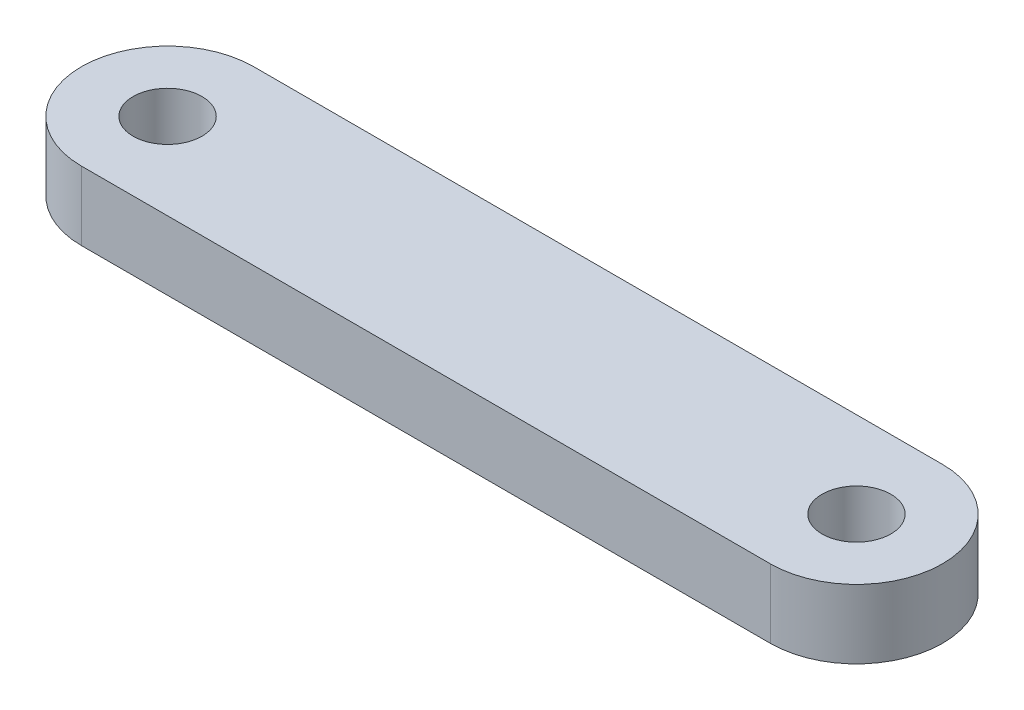
ISO-10303-21;
HEADER;
FILE_DESCRIPTION(('STEP AP214'),'2;1');
FILE_NAME('part.step','',(''),(''),'','','');
FILE_SCHEMA(('AUTOMOTIVE_DESIGN { 1 0 10303 214 1 1 1 1 }'));
ENDSEC;
DATA;
#1=APPLICATION_CONTEXT('core data for automotive mechanical design processes');
#2=APPLICATION_PROTOCOL_DEFINITION('international standard','automotive_design',2000,#1);
#3=PRODUCT_CONTEXT('',#1,'mechanical');
#4=PRODUCT('Part','Part','',(#3));
#5=PRODUCT_RELATED_PRODUCT_CATEGORY('part','',(#4));
#6=PRODUCT_DEFINITION_FORMATION('','',#4);
#7=PRODUCT_DEFINITION_CONTEXT('part definition',#1,'design');
#8=PRODUCT_DEFINITION('design','',#6,#7);
#9=PRODUCT_DEFINITION_SHAPE('','',#8);
#10=(LENGTH_UNIT() NAMED_UNIT(*) SI_UNIT(.MILLI.,.METRE.));
#11=(NAMED_UNIT(*) PLANE_ANGLE_UNIT() SI_UNIT($,.RADIAN.));
#12=(NAMED_UNIT(*) SI_UNIT($,.STERADIAN.) SOLID_ANGLE_UNIT());
#13=UNCERTAINTY_MEASURE_WITH_UNIT(LENGTH_MEASURE(1.E-05),#10,'distance_accuracy_value','');
#14=(GEOMETRIC_REPRESENTATION_CONTEXT(3) GLOBAL_UNCERTAINTY_ASSIGNED_CONTEXT((#13)) GLOBAL_UNIT_ASSIGNED_CONTEXT((#10,
#11,#12)) REPRESENTATION_CONTEXT('',''));
#15=CARTESIAN_POINT('',(0.,0.,0.));
#16=DIRECTION('',(0.,0.,1.));
#17=DIRECTION('',(1.,0.,0.));
#18=AXIS2_PLACEMENT_3D('',#15,#16,#17);
#19=CARTESIAN_POINT('',(-10.,2.,0.));
#20=DIRECTION('',(0.,1.,0.));
#21=DIRECTION('',(0.,0.,1.));
#22=AXIS2_PLACEMENT_3D('',#19,#20,#21);
#23=PLANE('',#22);
#24=CARTESIAN_POINT('',(10.,2.,0.));
#25=DIRECTION('',(0.,1.,0.));
#26=DIRECTION('',(0.,0.,1.));
#27=AXIS2_PLACEMENT_3D('',#24,#25,#26);
#28=CIRCLE('',#27,1.);
#29=CARTESIAN_POINT('',(10.,2.,1.));
#30=VERTEX_POINT('',#29);
#31=EDGE_CURVE('E104',#30,#30,#28,.T.);
#32=ORIENTED_EDGE('',*,*,#31,.F.);
#33=EDGE_LOOP('',(#32));
#34=FACE_BOUND('',#33,.T.);
#35=CARTESIAN_POINT('',(-10.,2.,0.));
#36=DIRECTION('',(0.,1.,0.));
#37=DIRECTION('',(0.,0.,1.));
#38=AXIS2_PLACEMENT_3D('',#35,#36,#37);
#39=CIRCLE('',#38,2.5);
#40=CARTESIAN_POINT('',(-10.,2.,-2.5));
#41=VERTEX_POINT('',#40);
#42=CARTESIAN_POINT('',(-10.,2.,2.5));
#43=VERTEX_POINT('',#42);
#44=EDGE_CURVE('E89',#41,#43,#39,.T.);
#45=ORIENTED_EDGE('',*,*,#44,.T.);
#46=DIRECTION('',(1.,0.,0.));
#47=VECTOR('',#46,1.);
#48=CARTESIAN_POINT('',(-10.,2.,2.5));
#49=LINE('',#48,#47);
#50=CARTESIAN_POINT('',(10.,2.,2.5));
#51=VERTEX_POINT('',#50);
#52=EDGE_CURVE('E84',#43,#51,#49,.T.);
#53=ORIENTED_EDGE('',*,*,#52,.T.);
#54=CARTESIAN_POINT('',(10.,2.,0.));
#55=DIRECTION('',(0.,1.,0.));
#56=DIRECTION('',(0.,0.,1.));
#57=AXIS2_PLACEMENT_3D('',#54,#55,#56);
#58=CIRCLE('',#57,2.5);
#59=CARTESIAN_POINT('',(10.,2.,-2.5));
#60=VERTEX_POINT('',#59);
#61=EDGE_CURVE('E87',#51,#60,#58,.T.);
#62=ORIENTED_EDGE('',*,*,#61,.T.);
#63=DIRECTION('',(-1.,0.,0.));
#64=VECTOR('',#63,1.);
#65=CARTESIAN_POINT('',(-10.,2.,-2.5));
#66=LINE('',#65,#64);
#67=EDGE_CURVE('E54',#60,#41,#66,.T.);
#68=ORIENTED_EDGE('',*,*,#67,.T.);
#69=EDGE_LOOP('',(#45,#53,#62,#68));
#70=FACE_BOUND('',#69,.T.);
#71=CARTESIAN_POINT('',(-10.,2.,0.));
#72=DIRECTION('',(0.,1.,0.));
#73=DIRECTION('',(0.,0.,1.));
#74=AXIS2_PLACEMENT_3D('',#71,#72,#73);
#75=CIRCLE('',#74,1.);
#76=CARTESIAN_POINT('',(-10.,2.,1.));
#77=VERTEX_POINT('',#76);
#78=EDGE_CURVE('E119',#77,#77,#75,.T.);
#79=ORIENTED_EDGE('',*,*,#78,.F.);
#80=EDGE_LOOP('',(#79));
#81=FACE_BOUND('',#80,.T.);
#82=ADVANCED_FACE('F37',(#34,#70,#81),#23,.T.);
#83=CARTESIAN_POINT('',(-10.,0.,0.));
#84=DIRECTION('',(0.,1.,0.));
#85=DIRECTION('',(0.,0.,1.));
#86=AXIS2_PLACEMENT_3D('',#83,#84,#85);
#87=PLANE('',#86);
#88=CARTESIAN_POINT('',(-10.,0.,0.));
#89=DIRECTION('',(0.,1.,0.));
#90=DIRECTION('',(0.,0.,1.));
#91=AXIS2_PLACEMENT_3D('',#88,#89,#90);
#92=CIRCLE('',#91,2.5);
#93=CARTESIAN_POINT('',(-10.,0.,-2.5));
#94=VERTEX_POINT('',#93);
#95=CARTESIAN_POINT('',(-10.,0.,2.5));
#96=VERTEX_POINT('',#95);
#97=EDGE_CURVE('E101',#94,#96,#92,.T.);
#98=ORIENTED_EDGE('',*,*,#97,.F.);
#99=DIRECTION('',(-1.,0.,0.));
#100=VECTOR('',#99,1.);
#101=CARTESIAN_POINT('',(-10.,0.,-2.5));
#102=LINE('',#101,#100);
#103=CARTESIAN_POINT('',(10.,0.,-2.5));
#104=VERTEX_POINT('',#103);
#105=EDGE_CURVE('E77',#104,#94,#102,.T.);
#106=ORIENTED_EDGE('',*,*,#105,.F.);
#107=CARTESIAN_POINT('',(10.,0.,0.));
#108=DIRECTION('',(0.,1.,0.));
#109=DIRECTION('',(0.,0.,1.));
#110=AXIS2_PLACEMENT_3D('',#107,#108,#109);
#111=CIRCLE('',#110,2.5);
#112=CARTESIAN_POINT('',(10.,0.,2.5));
#113=VERTEX_POINT('',#112);
#114=EDGE_CURVE('E71',#113,#104,#111,.T.);
#115=ORIENTED_EDGE('',*,*,#114,.F.);
#116=DIRECTION('',(1.,0.,0.));
#117=VECTOR('',#116,1.);
#118=CARTESIAN_POINT('',(-10.,0.,2.5));
#119=LINE('',#118,#117);
#120=EDGE_CURVE('E93',#96,#113,#119,.T.);
#121=ORIENTED_EDGE('',*,*,#120,.F.);
#122=EDGE_LOOP('',(#98,#106,#115,#121));
#123=FACE_BOUND('',#122,.T.);
#124=CARTESIAN_POINT('',(10.,0.,0.));
#125=DIRECTION('',(0.,1.,0.));
#126=DIRECTION('',(0.,0.,1.));
#127=AXIS2_PLACEMENT_3D('',#124,#125,#126);
#128=CIRCLE('',#127,1.);
#129=CARTESIAN_POINT('',(10.,0.,1.));
#130=VERTEX_POINT('',#129);
#131=EDGE_CURVE('E116',#130,#130,#128,.T.);
#132=ORIENTED_EDGE('',*,*,#131,.T.);
#133=EDGE_LOOP('',(#132));
#134=FACE_BOUND('',#133,.T.);
#135=CARTESIAN_POINT('',(-10.,0.,0.));
#136=DIRECTION('',(0.,1.,0.));
#137=DIRECTION('',(0.,0.,1.));
#138=AXIS2_PLACEMENT_3D('',#135,#136,#137);
#139=CIRCLE('',#138,1.);
#140=CARTESIAN_POINT('',(-10.,0.,1.));
#141=VERTEX_POINT('',#140);
#142=EDGE_CURVE('E122',#141,#141,#139,.T.);
#143=ORIENTED_EDGE('',*,*,#142,.T.);
#144=EDGE_LOOP('',(#143));
#145=FACE_BOUND('',#144,.T.);
#146=ADVANCED_FACE('F112',(#123,#134,#145),#87,.F.);
#147=CARTESIAN_POINT('',(-10.,2.,0.));
#148=DIRECTION('',(0.,-1.,0.));
#149=DIRECTION('',(0.,0.,-1.));
#150=AXIS2_PLACEMENT_3D('',#147,#148,#149);
#151=CYLINDRICAL_SURFACE('',#150,2.5);
#152=ORIENTED_EDGE('',*,*,#97,.T.);
#153=DIRECTION('',(0.,-1.,0.));
#154=VECTOR('',#153,1.);
#155=CARTESIAN_POINT('',(-10.,2.,2.5));
#156=LINE('',#155,#154);
#157=EDGE_CURVE('E11',#43,#96,#156,.T.);
#158=ORIENTED_EDGE('',*,*,#157,.F.);
#159=ORIENTED_EDGE('',*,*,#44,.F.);
#160=DIRECTION('',(0.,-1.,0.));
#161=VECTOR('',#160,1.);
#162=CARTESIAN_POINT('',(-10.,2.,-2.5));
#163=LINE('',#162,#161);
#164=EDGE_CURVE('E97',#41,#94,#163,.T.);
#165=ORIENTED_EDGE('',*,*,#164,.T.);
#166=EDGE_LOOP('',(#152,#158,#159,#165));
#167=FACE_BOUND('',#166,.T.);
#168=ADVANCED_FACE('F39',(#167),#151,.T.);
#169=CARTESIAN_POINT('',(-10.,2.,2.5));
#170=DIRECTION('',(0.,0.,-1.));
#171=DIRECTION('',(-1.,0.,0.));
#172=AXIS2_PLACEMENT_3D('',#169,#170,#171);
#173=PLANE('',#172);
#174=ORIENTED_EDGE('',*,*,#120,.T.);
#175=DIRECTION('',(0.,-1.,0.));
#176=VECTOR('',#175,1.);
#177=CARTESIAN_POINT('',(10.,2.,2.5));
#178=LINE('',#177,#176);
#179=EDGE_CURVE('E46',#51,#113,#178,.T.);
#180=ORIENTED_EDGE('',*,*,#179,.F.);
#181=ORIENTED_EDGE('',*,*,#52,.F.);
#182=ORIENTED_EDGE('',*,*,#157,.T.);
#183=EDGE_LOOP('',(#174,#180,#181,#182));
#184=FACE_BOUND('',#183,.T.);
#185=ADVANCED_FACE('F92',(#184),#173,.F.);
#186=CARTESIAN_POINT('',(10.,2.,0.));
#187=DIRECTION('',(0.,-1.,0.));
#188=DIRECTION('',(0.,0.,-1.));
#189=AXIS2_PLACEMENT_3D('',#186,#187,#188);
#190=CYLINDRICAL_SURFACE('',#189,2.5);
#191=ORIENTED_EDGE('',*,*,#114,.T.);
#192=DIRECTION('',(0.,-1.,0.));
#193=VECTOR('',#192,1.);
#194=CARTESIAN_POINT('',(10.,2.,-2.5));
#195=LINE('',#194,#193);
#196=EDGE_CURVE('E94',#60,#104,#195,.T.);
#197=ORIENTED_EDGE('',*,*,#196,.F.);
#198=ORIENTED_EDGE('',*,*,#61,.F.);
#199=ORIENTED_EDGE('',*,*,#179,.T.);
#200=EDGE_LOOP('',(#191,#197,#198,#199));
#201=FACE_BOUND('',#200,.T.);
#202=ADVANCED_FACE('F95',(#201),#190,.T.);
#203=CARTESIAN_POINT('',(-10.,2.,-2.5));
#204=DIRECTION('',(0.,0.,1.));
#205=DIRECTION('',(1.,0.,0.));
#206=AXIS2_PLACEMENT_3D('',#203,#204,#205);
#207=PLANE('',#206);
#208=ORIENTED_EDGE('',*,*,#105,.T.);
#209=ORIENTED_EDGE('',*,*,#164,.F.);
#210=ORIENTED_EDGE('',*,*,#67,.F.);
#211=ORIENTED_EDGE('',*,*,#196,.T.);
#212=EDGE_LOOP('',(#208,#209,#210,#211));
#213=FACE_BOUND('',#212,.T.);
#214=ADVANCED_FACE('F109',(#213),#207,.F.);
#215=CARTESIAN_POINT('',(10.,2.,0.));
#216=DIRECTION('',(0.,-1.,0.));
#217=DIRECTION('',(0.,0.,-1.));
#218=AXIS2_PLACEMENT_3D('',#215,#216,#217);
#219=CYLINDRICAL_SURFACE('',#218,1.);
#220=ORIENTED_EDGE('',*,*,#31,.T.);
#221=EDGE_LOOP('',(#220));
#222=FACE_BOUND('',#221,.T.);
#223=ORIENTED_EDGE('',*,*,#131,.F.);
#224=EDGE_LOOP('',(#223));
#225=FACE_BOUND('',#224,.T.);
#226=ADVANCED_FACE('F139',(#222,#225),#219,.F.);
#227=CARTESIAN_POINT('',(-10.,2.,0.));
#228=DIRECTION('',(0.,-1.,0.));
#229=DIRECTION('',(0.,0.,-1.));
#230=AXIS2_PLACEMENT_3D('',#227,#228,#229);
#231=CYLINDRICAL_SURFACE('',#230,1.);
#232=ORIENTED_EDGE('',*,*,#78,.T.);
#233=EDGE_LOOP('',(#232));
#234=FACE_BOUND('',#233,.T.);
#235=ORIENTED_EDGE('',*,*,#142,.F.);
#236=EDGE_LOOP('',(#235));
#237=FACE_BOUND('',#236,.T.);
#238=ADVANCED_FACE('F128',(#234,#237),#231,.F.);
#239=CLOSED_SHELL('',(#82,#146,#168,#185,#202,#214,#226,#238));
#240=MANIFOLD_SOLID_BREP('B2',#239);
#241=ADVANCED_BREP_SHAPE_REPRESENTATION('',(#18,#240),#14);
#242=SHAPE_DEFINITION_REPRESENTATION(#9,#241);
ENDSEC;
END-ISO-10303-21;
